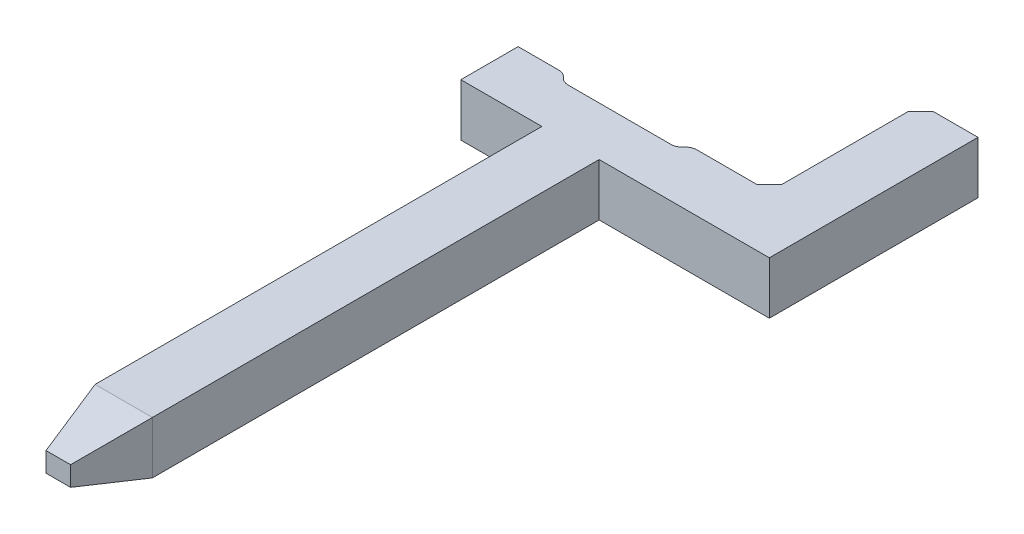
ISO-10303-21;
HEADER;
FILE_DESCRIPTION(('STEP AP214'),'2;1');
FILE_NAME('part.step','',(''),(''),'','','');
FILE_SCHEMA(('AUTOMOTIVE_DESIGN { 1 0 10303 214 1 1 1 1 }'));
ENDSEC;
DATA;
#1=APPLICATION_CONTEXT('core data for automotive mechanical design processes');
#2=APPLICATION_PROTOCOL_DEFINITION('international standard','automotive_design',2000,#1);
#3=PRODUCT_CONTEXT('',#1,'mechanical');
#4=PRODUCT('Part','Part','',(#3));
#5=PRODUCT_RELATED_PRODUCT_CATEGORY('part','',(#4));
#6=PRODUCT_DEFINITION_FORMATION('','',#4);
#7=PRODUCT_DEFINITION_CONTEXT('part definition',#1,'design');
#8=PRODUCT_DEFINITION('design','',#6,#7);
#9=PRODUCT_DEFINITION_SHAPE('','',#8);
#10=(LENGTH_UNIT() NAMED_UNIT(*) SI_UNIT(.MILLI.,.METRE.));
#11=(NAMED_UNIT(*) PLANE_ANGLE_UNIT() SI_UNIT($,.RADIAN.));
#12=(NAMED_UNIT(*) SI_UNIT($,.STERADIAN.) SOLID_ANGLE_UNIT());
#13=UNCERTAINTY_MEASURE_WITH_UNIT(LENGTH_MEASURE(1.E-05),#10,'distance_accuracy_value','');
#14=(GEOMETRIC_REPRESENTATION_CONTEXT(3) GLOBAL_UNCERTAINTY_ASSIGNED_CONTEXT((#13)) GLOBAL_UNIT_ASSIGNED_CONTEXT((#10,
#11,#12)) REPRESENTATION_CONTEXT('',''));
#15=CARTESIAN_POINT('',(0.,0.,0.));
#16=DIRECTION('',(0.,0.,1.));
#17=DIRECTION('',(1.,0.,0.));
#18=AXIS2_PLACEMENT_3D('',#15,#16,#17);
#19=CARTESIAN_POINT('',(3.23,-13.82,-4.6));
#20=DIRECTION('',(-0.707106781186548,0.,-0.707106781186548));
#21=DIRECTION('',(-0.707106781186548,0.,0.707106781186548));
#22=AXIS2_PLACEMENT_3D('',#19,#20,#21);
#23=PLANE('',#22);
#24=DIRECTION('',(0.707106781186548,0.,-0.707106781186548));
#25=VECTOR('',#24,1.);
#26=CARTESIAN_POINT('',(2.64065044188854,-13.82,-4.01065044188854));
#27=LINE('',#26,#25);
#28=CARTESIAN_POINT('',(3.08,-13.82,-4.45));
#29=VERTEX_POINT('',#28);
#30=CARTESIAN_POINT('',(3.23,-13.82,-4.6));
#31=VERTEX_POINT('',#30);
#32=EDGE_CURVE('E307',#29,#31,#27,.T.);
#33=ORIENTED_EDGE('',*,*,#32,.F.);
#34=DIRECTION('',(0.,-1.,0.));
#35=VECTOR('',#34,1.);
#36=CARTESIAN_POINT('',(3.08,-13.82,-4.45));
#37=LINE('',#36,#35);
#38=CARTESIAN_POINT('',(3.08,-13.18,-4.45));
#39=VERTEX_POINT('',#38);
#40=EDGE_CURVE('E234',#39,#29,#37,.T.);
#41=ORIENTED_EDGE('',*,*,#40,.F.);
#42=DIRECTION('',(-0.707106781186548,0.,0.707106781186548));
#43=VECTOR('',#42,1.);
#44=CARTESIAN_POINT('',(3.23,-13.18,-4.6));
#45=LINE('',#44,#43);
#46=CARTESIAN_POINT('',(3.23,-13.18,-4.6));
#47=VERTEX_POINT('',#46);
#48=EDGE_CURVE('E231',#47,#39,#45,.T.);
#49=ORIENTED_EDGE('',*,*,#48,.F.);
#50=DIRECTION('',(0.,1.,0.));
#51=VECTOR('',#50,1.);
#52=CARTESIAN_POINT('',(3.23,-13.18,-4.6));
#53=LINE('',#52,#51);
#54=EDGE_CURVE('E235',#31,#47,#53,.T.);
#55=ORIENTED_EDGE('',*,*,#54,.F.);
#56=EDGE_LOOP('',(#33,#41,#49,#55));
#57=FACE_BOUND('',#56,.T.);
#58=ADVANCED_FACE('F16',(#57),#23,.T.);
#59=CARTESIAN_POINT('',(3.38,-13.82,-6.3));
#60=DIRECTION('',(0.707106781186548,0.,0.707106781186548));
#61=DIRECTION('',(0.,-1.,0.));
#62=AXIS2_PLACEMENT_3D('',#59,#60,#61);
#63=PLANE('',#62);
#64=DIRECTION('',(0.707106781186548,0.,-0.707106781186548));
#65=VECTOR('',#64,1.);
#66=CARTESIAN_POINT('',(3.38,-13.82,-6.3));
#67=LINE('',#66,#65);
#68=CARTESIAN_POINT('',(3.23,-13.82,-6.15));
#69=VERTEX_POINT('',#68);
#70=CARTESIAN_POINT('',(3.38,-13.82,-6.3));
#71=VERTEX_POINT('',#70);
#72=EDGE_CURVE('E355',#69,#71,#67,.T.);
#73=ORIENTED_EDGE('',*,*,#72,.F.);
#74=DIRECTION('',(0.,-1.,0.));
#75=VECTOR('',#74,1.);
#76=CARTESIAN_POINT('',(3.23,-13.82,-6.15));
#77=LINE('',#76,#75);
#78=CARTESIAN_POINT('',(3.23,-13.18,-6.15));
#79=VERTEX_POINT('',#78);
#80=EDGE_CURVE('E296',#79,#69,#77,.T.);
#81=ORIENTED_EDGE('',*,*,#80,.F.);
#82=DIRECTION('',(-0.707106781186548,0.,0.707106781186548));
#83=VECTOR('',#82,1.);
#84=CARTESIAN_POINT('',(1.86565044188855,-13.18,-4.78565044188854));
#85=LINE('',#84,#83);
#86=CARTESIAN_POINT('',(3.38,-13.18,-6.3));
#87=VERTEX_POINT('',#86);
#88=EDGE_CURVE('E311',#87,#79,#85,.T.);
#89=ORIENTED_EDGE('',*,*,#88,.F.);
#90=DIRECTION('',(0.,1.,0.));
#91=VECTOR('',#90,1.);
#92=CARTESIAN_POINT('',(3.38,-13.82,-6.3));
#93=LINE('',#92,#91);
#94=EDGE_CURVE('E365',#71,#87,#93,.T.);
#95=ORIENTED_EDGE('',*,*,#94,.F.);
#96=EDGE_LOOP('',(#73,#81,#89,#95));
#97=FACE_BOUND('',#96,.T.);
#98=ADVANCED_FACE('F472',(#97),#63,.F.);
#99=CARTESIAN_POINT('',(2.34617265627772,-13.18,1.71));
#100=DIRECTION('',(0.,-0.970142500145332,-0.242535625036333));
#101=DIRECTION('',(0.,0.242535625036333,-0.970142500145332));
#102=AXIS2_PLACEMENT_3D('',#99,#100,#101);
#103=PLANE('',#102);
#104=DIRECTION('',(0.235702260395516,-0.235702260395516,0.942809041582063));
#105=VECTOR('',#104,1.);
#106=CARTESIAN_POINT('',(1.18555555555556,-13.2155555555556,1.85222222222222));
#107=LINE('',#106,#105);
#108=CARTESIAN_POINT('',(1.15,-13.18,1.71));
#109=VERTEX_POINT('',#108);
#110=CARTESIAN_POINT('',(1.35,-13.38,2.51));
#111=VERTEX_POINT('',#110);
#112=EDGE_CURVE('E26',#109,#111,#107,.T.);
#113=ORIENTED_EDGE('',*,*,#112,.T.);
#114=DIRECTION('',(-1.,0.,0.));
#115=VECTOR('',#114,1.);
#116=CARTESIAN_POINT('',(1.85,-13.38,2.51));
#117=LINE('',#116,#115);
#118=CARTESIAN_POINT('',(1.65,-13.38,2.51));
#119=VERTEX_POINT('',#118);
#120=EDGE_CURVE('E343',#119,#111,#117,.T.);
#121=ORIENTED_EDGE('',*,*,#120,.F.);
#122=DIRECTION('',(0.235702260395516,0.235702260395516,-0.942809041582063));
#123=VECTOR('',#122,1.);
#124=CARTESIAN_POINT('',(1.62555555555556,-13.4044444444444,2.60777777777778));
#125=LINE('',#124,#123);
#126=CARTESIAN_POINT('',(1.85,-13.18,1.71));
#127=VERTEX_POINT('',#126);
#128=EDGE_CURVE('E11',#119,#127,#125,.T.);
#129=ORIENTED_EDGE('',*,*,#128,.T.);
#130=DIRECTION('',(1.,0.,0.));
#131=VECTOR('',#130,1.);
#132=CARTESIAN_POINT('',(2.34617265627772,-13.18,1.71));
#133=LINE('',#132,#131);
#134=EDGE_CURVE('E346',#109,#127,#133,.T.);
#135=ORIENTED_EDGE('',*,*,#134,.F.);
#136=EDGE_LOOP('',(#113,#121,#129,#135));
#137=FACE_BOUND('',#136,.T.);
#138=ADVANCED_FACE('F544',(#137),#103,.F.);
#139=CARTESIAN_POINT('',(1.65,-13.82,2.51));
#140=DIRECTION('',(-0.970142500145332,0.,-0.242535625036333));
#141=DIRECTION('',(-0.242535625036333,0.,0.970142500145332));
#142=AXIS2_PLACEMENT_3D('',#139,#140,#141);
#143=PLANE('',#142);
#144=DIRECTION('',(0.235702260395516,-0.235702260395516,-0.942809041582063));
#145=VECTOR('',#144,1.);
#146=CARTESIAN_POINT('',(1.66111111111111,-13.6311111111111,2.46555555555556));
#147=LINE('',#146,#145);
#148=CARTESIAN_POINT('',(1.65,-13.62,2.51));
#149=VERTEX_POINT('',#148);
#150=CARTESIAN_POINT('',(1.85,-13.82,1.71));
#151=VERTEX_POINT('',#150);
#152=EDGE_CURVE('E386',#149,#151,#147,.T.);
#153=ORIENTED_EDGE('',*,*,#152,.T.);
#154=DIRECTION('',(0.,-1.,0.));
#155=VECTOR('',#154,1.);
#156=CARTESIAN_POINT('',(1.85,-13.82,1.71));
#157=LINE('',#156,#155);
#158=EDGE_CURVE('E262',#127,#151,#157,.T.);
#159=ORIENTED_EDGE('',*,*,#158,.F.);
#160=ORIENTED_EDGE('',*,*,#128,.F.);
#161=DIRECTION('',(0.,1.,0.));
#162=VECTOR('',#161,1.);
#163=CARTESIAN_POINT('',(1.65,-13.82,2.51));
#164=LINE('',#163,#162);
#165=EDGE_CURVE('E377',#149,#119,#164,.T.);
#166=ORIENTED_EDGE('',*,*,#165,.F.);
#167=EDGE_LOOP('',(#153,#159,#160,#166));
#168=FACE_BOUND('',#167,.T.);
#169=ADVANCED_FACE('F548',(#168),#143,.F.);
#170=CARTESIAN_POINT('',(1.15,-13.82,1.71));
#171=DIRECTION('',(0.970142500145332,0.,-0.242535625036333));
#172=DIRECTION('',(0.,-1.,0.));
#173=AXIS2_PLACEMENT_3D('',#170,#171,#172);
#174=PLANE('',#173);
#175=DIRECTION('',(0.235702260395516,0.235702260395516,0.942809041582063));
#176=VECTOR('',#175,1.);
#177=CARTESIAN_POINT('',(1.15,-13.82,1.71));
#178=LINE('',#177,#176);
#179=CARTESIAN_POINT('',(1.15,-13.82,1.71));
#180=VERTEX_POINT('',#179);
#181=CARTESIAN_POINT('',(1.35,-13.62,2.51));
#182=VERTEX_POINT('',#181);
#183=EDGE_CURVE('E40',#180,#182,#178,.T.);
#184=ORIENTED_EDGE('',*,*,#183,.T.);
#185=DIRECTION('',(0.,-1.,0.));
#186=VECTOR('',#185,1.);
#187=CARTESIAN_POINT('',(1.35,-13.82,2.51));
#188=LINE('',#187,#186);
#189=EDGE_CURVE('E339',#111,#182,#188,.T.);
#190=ORIENTED_EDGE('',*,*,#189,.F.);
#191=ORIENTED_EDGE('',*,*,#112,.F.);
#192=DIRECTION('',(0.,1.,0.));
#193=VECTOR('',#192,1.);
#194=CARTESIAN_POINT('',(1.15,-13.82,1.71));
#195=LINE('',#194,#193);
#196=EDGE_CURVE('E347',#180,#109,#195,.T.);
#197=ORIENTED_EDGE('',*,*,#196,.F.);
#198=EDGE_LOOP('',(#184,#190,#191,#197));
#199=FACE_BOUND('',#198,.T.);
#200=ADVANCED_FACE('F558',(#199),#174,.F.);
#201=CARTESIAN_POINT('',(1.85,-13.62,2.51));
#202=DIRECTION('',(0.,-0.970142500145332,0.242535625036333));
#203=DIRECTION('',(-1.,0.,0.));
#204=AXIS2_PLACEMENT_3D('',#201,#202,#203);
#205=PLANE('',#204);
#206=ORIENTED_EDGE('',*,*,#152,.F.);
#207=DIRECTION('',(1.,0.,0.));
#208=VECTOR('',#207,1.);
#209=CARTESIAN_POINT('',(1.85,-13.62,2.51));
#210=LINE('',#209,#208);
#211=EDGE_CURVE('E19',#182,#149,#210,.T.);
#212=ORIENTED_EDGE('',*,*,#211,.F.);
#213=ORIENTED_EDGE('',*,*,#183,.F.);
#214=DIRECTION('',(-1.,0.,0.));
#215=VECTOR('',#214,1.);
#216=CARTESIAN_POINT('',(1.15,-13.82,1.71));
#217=LINE('',#216,#215);
#218=EDGE_CURVE('E312',#151,#180,#217,.T.);
#219=ORIENTED_EDGE('',*,*,#218,.F.);
#220=EDGE_LOOP('',(#206,#212,#213,#219));
#221=FACE_BOUND('',#220,.T.);
#222=ADVANCED_FACE('F561',(#221),#205,.T.);
#223=CARTESIAN_POINT('',(2.34617265627772,-13.18,-4.30512822749936));
#224=DIRECTION('',(0.,1.,0.));
#225=DIRECTION('',(1.,0.,0.));
#226=AXIS2_PLACEMENT_3D('',#223,#224,#225);
#227=PLANE('',#226);
#228=DIRECTION('',(-1.,0.,0.));
#229=VECTOR('',#228,1.);
#230=CARTESIAN_POINT('',(3.93,-13.18,-6.3));
#231=LINE('',#230,#229);
#232=CARTESIAN_POINT('',(3.93,-13.18,-6.3));
#233=VERTEX_POINT('',#232);
#234=EDGE_CURVE('E362',#233,#87,#231,.T.);
#235=ORIENTED_EDGE('',*,*,#234,.T.);
#236=ORIENTED_EDGE('',*,*,#88,.T.);
#237=DIRECTION('',(0.,0.,1.));
#238=VECTOR('',#237,1.);
#239=CARTESIAN_POINT('',(3.23,-13.18,-6.3));
#240=LINE('',#239,#238);
#241=EDGE_CURVE('E300',#79,#47,#240,.T.);
#242=ORIENTED_EDGE('',*,*,#241,.T.);
#243=ORIENTED_EDGE('',*,*,#48,.T.);
#244=DIRECTION('',(-1.,0.,0.));
#245=VECTOR('',#244,1.);
#246=CARTESIAN_POINT('',(3.23,-13.18,-4.45));
#247=LINE('',#246,#245);
#248=CARTESIAN_POINT('',(2.34617265627772,-13.18,-4.45));
#249=VERTEX_POINT('',#248);
#250=EDGE_CURVE('E223',#39,#249,#247,.T.);
#251=ORIENTED_EDGE('',*,*,#250,.T.);
#252=CARTESIAN_POINT('',(2.34617265627772,-13.18,-4.30512822749936));
#253=DIRECTION('',(0.,1.,0.));
#254=DIRECTION('',(0.,0.,1.));
#255=AXIS2_PLACEMENT_3D('',#252,#253,#254);
#256=CIRCLE('',#255,0.144871772500637);
#257=CARTESIAN_POINT('',(2.23615942304884,-13.18,-4.39938807569574));
#258=VERTEX_POINT('',#257);
#259=EDGE_CURVE('E205',#249,#258,#256,.T.);
#260=ORIENTED_EDGE('',*,*,#259,.T.);
#261=CARTESIAN_POINT('',(2.12614618981995,-13.18,-4.49364792389211));
#262=DIRECTION('',(0.,-1.,0.));
#263=DIRECTION('',(0.,0.,-1.));
#264=AXIS2_PLACEMENT_3D('',#261,#262,#263);
#265=CIRCLE('',#264,0.144871772500637);
#266=CARTESIAN_POINT('',(2.12614618981995,-13.18,-4.34877615139147));
#267=VERTEX_POINT('',#266);
#268=EDGE_CURVE('E248',#258,#267,#265,.T.);
#269=ORIENTED_EDGE('',*,*,#268,.T.);
#270=DIRECTION('',(-1.,0.,0.));
#271=VECTOR('',#270,1.);
#272=CARTESIAN_POINT('',(0.873853810180058,-13.18,-4.34877615139147));
#273=LINE('',#272,#271);
#274=CARTESIAN_POINT('',(0.873853810180058,-13.18,-4.34877615139147));
#275=VERTEX_POINT('',#274);
#276=EDGE_CURVE('E283',#267,#275,#273,.T.);
#277=ORIENTED_EDGE('',*,*,#276,.T.);
#278=CARTESIAN_POINT('',(0.873853810180058,-13.18,-4.49364792389211));
#279=DIRECTION('',(0.,-1.,0.));
#280=DIRECTION('',(0.,0.,-1.));
#281=AXIS2_PLACEMENT_3D('',#278,#279,#280);
#282=CIRCLE('',#281,0.144871772500637);
#283=CARTESIAN_POINT('',(0.763840576951171,-13.18,-4.39938807569574));
#284=VERTEX_POINT('',#283);
#285=EDGE_CURVE('E281',#275,#284,#282,.T.);
#286=ORIENTED_EDGE('',*,*,#285,.T.);
#287=CARTESIAN_POINT('',(0.65382734372228,-13.18,-4.30512822749936));
#288=DIRECTION('',(0.,1.,0.));
#289=DIRECTION('',(0.,0.,1.));
#290=AXIS2_PLACEMENT_3D('',#287,#288,#289);
#291=CIRCLE('',#290,0.144871772500637);
#292=CARTESIAN_POINT('',(0.65382734372228,-13.18,-4.45));
#293=VERTEX_POINT('',#292);
#294=EDGE_CURVE('E249',#284,#293,#291,.T.);
#295=ORIENTED_EDGE('',*,*,#294,.T.);
#296=DIRECTION('',(-1.,0.,0.));
#297=VECTOR('',#296,1.);
#298=CARTESIAN_POINT('',(0.65382734372228,-13.18,-4.45));
#299=LINE('',#298,#297);
#300=CARTESIAN_POINT('',(0.16000000000001,-13.18,-4.45));
#301=VERTEX_POINT('',#300);
#302=EDGE_CURVE('E142',#293,#301,#299,.T.);
#303=ORIENTED_EDGE('',*,*,#302,.T.);
#304=DIRECTION('',(0.,0.,1.));
#305=VECTOR('',#304,1.);
#306=CARTESIAN_POINT('',(0.16000000000001,-13.18,-4.45));
#307=LINE('',#306,#305);
#308=CARTESIAN_POINT('',(0.16000000000001,-13.18,-3.75));
#309=VERTEX_POINT('',#308);
#310=EDGE_CURVE('E266',#301,#309,#307,.T.);
#311=ORIENTED_EDGE('',*,*,#310,.T.);
#312=DIRECTION('',(1.,0.,0.));
#313=VECTOR('',#312,1.);
#314=CARTESIAN_POINT('',(0.16000000000001,-13.18,-3.75));
#315=LINE('',#314,#313);
#316=CARTESIAN_POINT('',(1.15,-13.18,-3.75));
#317=VERTEX_POINT('',#316);
#318=EDGE_CURVE('E271',#309,#317,#315,.T.);
#319=ORIENTED_EDGE('',*,*,#318,.T.);
#320=DIRECTION('',(0.,0.,1.));
#321=VECTOR('',#320,1.);
#322=CARTESIAN_POINT('',(1.15,-13.18,2.51));
#323=LINE('',#322,#321);
#324=EDGE_CURVE('E351',#317,#109,#323,.T.);
#325=ORIENTED_EDGE('',*,*,#324,.T.);
#326=ORIENTED_EDGE('',*,*,#134,.T.);
#327=DIRECTION('',(0.,0.,-1.));
#328=VECTOR('',#327,1.);
#329=CARTESIAN_POINT('',(1.85,-13.18,-3.75));
#330=LINE('',#329,#328);
#331=CARTESIAN_POINT('',(1.85,-13.18,-3.75));
#332=VERTEX_POINT('',#331);
#333=EDGE_CURVE('E273',#127,#332,#330,.T.);
#334=ORIENTED_EDGE('',*,*,#333,.T.);
#335=DIRECTION('',(1.,0.,0.));
#336=VECTOR('',#335,1.);
#337=CARTESIAN_POINT('',(1.85,-13.18,-3.75));
#338=LINE('',#337,#336);
#339=CARTESIAN_POINT('',(3.93,-13.18,-3.75));
#340=VERTEX_POINT('',#339);
#341=EDGE_CURVE('E295',#332,#340,#338,.T.);
#342=ORIENTED_EDGE('',*,*,#341,.T.);
#343=DIRECTION('',(0.,0.,-1.));
#344=VECTOR('',#343,1.);
#345=CARTESIAN_POINT('',(3.93,-13.18,-3.75));
#346=LINE('',#345,#344);
#347=EDGE_CURVE('E315',#340,#233,#346,.T.);
#348=ORIENTED_EDGE('',*,*,#347,.T.);
#349=EDGE_LOOP('',(#235,#236,#242,#243,#251,#260,#269,#277,#286,#295,#303,#311,#319,#325,#326,
#334,#342,#348));
#350=FACE_BOUND('',#349,.T.);
#351=ADVANCED_FACE('F229',(#350),#227,.T.);
#352=CARTESIAN_POINT('',(2.34617265627772,-13.82,-4.30512822749936));
#353=DIRECTION('',(0.,1.,0.));
#354=DIRECTION('',(1.,0.,0.));
#355=AXIS2_PLACEMENT_3D('',#352,#353,#354);
#356=PLANE('',#355);
#357=DIRECTION('',(0.,0.,1.));
#358=VECTOR('',#357,1.);
#359=CARTESIAN_POINT('',(3.23,-13.82,-6.3));
#360=LINE('',#359,#358);
#361=EDGE_CURVE('E243',#69,#31,#360,.T.);
#362=ORIENTED_EDGE('',*,*,#361,.F.);
#363=ORIENTED_EDGE('',*,*,#72,.T.);
#364=DIRECTION('',(-1.,0.,0.));
#365=VECTOR('',#364,1.);
#366=CARTESIAN_POINT('',(3.93,-13.82,-6.3));
#367=LINE('',#366,#365);
#368=CARTESIAN_POINT('',(3.93,-13.82,-6.3));
#369=VERTEX_POINT('',#368);
#370=EDGE_CURVE('E387',#369,#71,#367,.T.);
#371=ORIENTED_EDGE('',*,*,#370,.F.);
#372=DIRECTION('',(0.,0.,-1.));
#373=VECTOR('',#372,1.);
#374=CARTESIAN_POINT('',(3.93,-13.82,-3.75));
#375=LINE('',#374,#373);
#376=CARTESIAN_POINT('',(3.93,-13.82,-3.75));
#377=VERTEX_POINT('',#376);
#378=EDGE_CURVE('E357',#377,#369,#375,.T.);
#379=ORIENTED_EDGE('',*,*,#378,.F.);
#380=DIRECTION('',(1.,0.,0.));
#381=VECTOR('',#380,1.);
#382=CARTESIAN_POINT('',(1.85,-13.82,-3.75));
#383=LINE('',#382,#381);
#384=CARTESIAN_POINT('',(1.85,-13.82,-3.75));
#385=VERTEX_POINT('',#384);
#386=EDGE_CURVE('E290',#385,#377,#383,.T.);
#387=ORIENTED_EDGE('',*,*,#386,.F.);
#388=DIRECTION('',(0.,0.,-1.));
#389=VECTOR('',#388,1.);
#390=CARTESIAN_POINT('',(1.85,-13.82,-3.75));
#391=LINE('',#390,#389);
#392=EDGE_CURVE('E257',#151,#385,#391,.T.);
#393=ORIENTED_EDGE('',*,*,#392,.F.);
#394=ORIENTED_EDGE('',*,*,#218,.T.);
#395=DIRECTION('',(0.,0.,1.));
#396=VECTOR('',#395,1.);
#397=CARTESIAN_POINT('',(1.15,-13.82,2.51));
#398=LINE('',#397,#396);
#399=CARTESIAN_POINT('',(1.15,-13.82,-3.75));
#400=VERTEX_POINT('',#399);
#401=EDGE_CURVE('E352',#400,#180,#398,.T.);
#402=ORIENTED_EDGE('',*,*,#401,.F.);
#403=DIRECTION('',(1.,0.,0.));
#404=VECTOR('',#403,1.);
#405=CARTESIAN_POINT('',(0.16000000000001,-13.82,-3.75));
#406=LINE('',#405,#404);
#407=CARTESIAN_POINT('',(0.16000000000001,-13.82,-3.75));
#408=VERTEX_POINT('',#407);
#409=EDGE_CURVE('E317',#408,#400,#406,.T.);
#410=ORIENTED_EDGE('',*,*,#409,.F.);
#411=DIRECTION('',(0.,0.,1.));
#412=VECTOR('',#411,1.);
#413=CARTESIAN_POINT('',(0.16000000000001,-13.82,-4.45));
#414=LINE('',#413,#412);
#415=CARTESIAN_POINT('',(0.16000000000001,-13.82,-4.45));
#416=VERTEX_POINT('',#415);
#417=EDGE_CURVE('E272',#416,#408,#414,.T.);
#418=ORIENTED_EDGE('',*,*,#417,.F.);
#419=DIRECTION('',(-1.,0.,0.));
#420=VECTOR('',#419,1.);
#421=CARTESIAN_POINT('',(0.65382734372228,-13.82,-4.45));
#422=LINE('',#421,#420);
#423=CARTESIAN_POINT('',(0.65382734372228,-13.82,-4.45));
#424=VERTEX_POINT('',#423);
#425=EDGE_CURVE('E128',#424,#416,#422,.T.);
#426=ORIENTED_EDGE('',*,*,#425,.F.);
#427=CARTESIAN_POINT('',(0.65382734372228,-13.82,-4.30512822749936));
#428=DIRECTION('',(0.,1.,0.));
#429=DIRECTION('',(0.,0.,1.));
#430=AXIS2_PLACEMENT_3D('',#427,#428,#429);
#431=CIRCLE('',#430,0.144871772500637);
#432=CARTESIAN_POINT('',(0.763840576951171,-13.82,-4.39938807569574));
#433=VERTEX_POINT('',#432);
#434=EDGE_CURVE('E253',#433,#424,#431,.T.);
#435=ORIENTED_EDGE('',*,*,#434,.F.);
#436=CARTESIAN_POINT('',(0.873853810180058,-13.82,-4.49364792389211));
#437=DIRECTION('',(0.,-1.,0.));
#438=DIRECTION('',(0.,0.,-1.));
#439=AXIS2_PLACEMENT_3D('',#436,#437,#438);
#440=CIRCLE('',#439,0.144871772500637);
#441=CARTESIAN_POINT('',(0.873853810180058,-13.82,-4.34877615139147));
#442=VERTEX_POINT('',#441);
#443=EDGE_CURVE('E325',#442,#433,#440,.T.);
#444=ORIENTED_EDGE('',*,*,#443,.F.);
#445=DIRECTION('',(-1.,0.,0.));
#446=VECTOR('',#445,1.);
#447=CARTESIAN_POINT('',(0.873853810180058,-13.82,-4.34877615139147));
#448=LINE('',#447,#446);
#449=CARTESIAN_POINT('',(2.12614618981995,-13.82,-4.34877615139147));
#450=VERTEX_POINT('',#449);
#451=EDGE_CURVE('E282',#450,#442,#448,.T.);
#452=ORIENTED_EDGE('',*,*,#451,.F.);
#453=CARTESIAN_POINT('',(2.12614618981995,-13.82,-4.49364792389211));
#454=DIRECTION('',(0.,-1.,0.));
#455=DIRECTION('',(0.,0.,-1.));
#456=AXIS2_PLACEMENT_3D('',#453,#454,#455);
#457=CIRCLE('',#456,0.144871772500637);
#458=CARTESIAN_POINT('',(2.23615942304884,-13.82,-4.39938807569574));
#459=VERTEX_POINT('',#458);
#460=EDGE_CURVE('E332',#459,#450,#457,.T.);
#461=ORIENTED_EDGE('',*,*,#460,.F.);
#462=CARTESIAN_POINT('',(2.34617265627772,-13.82,-4.30512822749936));
#463=DIRECTION('',(0.,1.,0.));
#464=DIRECTION('',(0.,0.,1.));
#465=AXIS2_PLACEMENT_3D('',#462,#463,#464);
#466=CIRCLE('',#465,0.144871772500637);
#467=CARTESIAN_POINT('',(2.34617265627772,-13.82,-4.45));
#468=VERTEX_POINT('',#467);
#469=EDGE_CURVE('E217',#468,#459,#466,.T.);
#470=ORIENTED_EDGE('',*,*,#469,.F.);
#471=DIRECTION('',(-1.,0.,0.));
#472=VECTOR('',#471,1.);
#473=CARTESIAN_POINT('',(3.23,-13.82,-4.45));
#474=LINE('',#473,#472);
#475=EDGE_CURVE('E225',#29,#468,#474,.T.);
#476=ORIENTED_EDGE('',*,*,#475,.F.);
#477=ORIENTED_EDGE('',*,*,#32,.T.);
#478=EDGE_LOOP('',(#362,#363,#371,#379,#387,#393,#394,#402,#410,#418,#426,#435,#444,#452,#461,
#470,#476,#477));
#479=FACE_BOUND('',#478,.T.);
#480=ADVANCED_FACE('F483',(#479),#356,.F.);
#481=CARTESIAN_POINT('',(1.85,-13.82,2.51));
#482=DIRECTION('',(0.,0.,1.));
#483=DIRECTION('',(1.,0.,0.));
#484=AXIS2_PLACEMENT_3D('',#481,#482,#483);
#485=PLANE('',#484);
#486=ORIENTED_EDGE('',*,*,#165,.T.);
#487=ORIENTED_EDGE('',*,*,#120,.T.);
#488=ORIENTED_EDGE('',*,*,#189,.T.);
#489=ORIENTED_EDGE('',*,*,#211,.T.);
#490=EDGE_LOOP('',(#486,#487,#488,#489));
#491=FACE_BOUND('',#490,.T.);
#492=ADVANCED_FACE('F564',(#491),#485,.T.);
#493=CARTESIAN_POINT('',(1.15,-13.82,2.51));
#494=DIRECTION('',(-1.,0.,0.));
#495=DIRECTION('',(0.,0.,1.));
#496=AXIS2_PLACEMENT_3D('',#493,#494,#495);
#497=PLANE('',#496);
#498=ORIENTED_EDGE('',*,*,#401,.T.);
#499=ORIENTED_EDGE('',*,*,#196,.T.);
#500=ORIENTED_EDGE('',*,*,#324,.F.);
#501=DIRECTION('',(0.,1.,0.));
#502=VECTOR('',#501,1.);
#503=CARTESIAN_POINT('',(1.15,-13.82,-3.75));
#504=LINE('',#503,#502);
#505=EDGE_CURVE('E321',#400,#317,#504,.T.);
#506=ORIENTED_EDGE('',*,*,#505,.F.);
#507=EDGE_LOOP('',(#498,#499,#500,#506));
#508=FACE_BOUND('',#507,.T.);
#509=ADVANCED_FACE('F567',(#508),#497,.T.);
#510=CARTESIAN_POINT('',(0.16000000000001,-13.82,-3.75));
#511=DIRECTION('',(0.,0.,1.));
#512=DIRECTION('',(1.,0.,0.));
#513=AXIS2_PLACEMENT_3D('',#510,#511,#512);
#514=PLANE('',#513);
#515=ORIENTED_EDGE('',*,*,#318,.F.);
#516=DIRECTION('',(0.,1.,0.));
#517=VECTOR('',#516,1.);
#518=CARTESIAN_POINT('',(0.16000000000001,-13.82,-3.75));
#519=LINE('',#518,#517);
#520=EDGE_CURVE('E267',#408,#309,#519,.T.);
#521=ORIENTED_EDGE('',*,*,#520,.F.);
#522=ORIENTED_EDGE('',*,*,#409,.T.);
#523=ORIENTED_EDGE('',*,*,#505,.T.);
#524=EDGE_LOOP('',(#515,#521,#522,#523));
#525=FACE_BOUND('',#524,.T.);
#526=ADVANCED_FACE('F404',(#525),#514,.T.);
#527=CARTESIAN_POINT('',(0.16000000000001,-13.82,-4.45));
#528=DIRECTION('',(-1.,0.,0.));
#529=DIRECTION('',(0.,0.,1.));
#530=AXIS2_PLACEMENT_3D('',#527,#528,#529);
#531=PLANE('',#530);
#532=ORIENTED_EDGE('',*,*,#310,.F.);
#533=DIRECTION('',(0.,1.,0.));
#534=VECTOR('',#533,1.);
#535=CARTESIAN_POINT('',(0.16000000000001,-13.82,-4.45));
#536=LINE('',#535,#534);
#537=EDGE_CURVE('E263',#416,#301,#536,.T.);
#538=ORIENTED_EDGE('',*,*,#537,.F.);
#539=ORIENTED_EDGE('',*,*,#417,.T.);
#540=ORIENTED_EDGE('',*,*,#520,.T.);
#541=EDGE_LOOP('',(#532,#538,#539,#540));
#542=FACE_BOUND('',#541,.T.);
#543=ADVANCED_FACE('F410',(#542),#531,.T.);
#544=CARTESIAN_POINT('',(0.65382734372228,-13.82,-4.45));
#545=DIRECTION('',(0.,0.,-1.));
#546=DIRECTION('',(0.,-1.,0.));
#547=AXIS2_PLACEMENT_3D('',#544,#545,#546);
#548=PLANE('',#547);
#549=ORIENTED_EDGE('',*,*,#302,.F.);
#550=DIRECTION('',(0.,1.,0.));
#551=VECTOR('',#550,1.);
#552=CARTESIAN_POINT('',(0.65382734372228,-13.82,-4.45));
#553=LINE('',#552,#551);
#554=EDGE_CURVE('E374',#424,#293,#553,.T.);
#555=ORIENTED_EDGE('',*,*,#554,.F.);
#556=ORIENTED_EDGE('',*,*,#425,.T.);
#557=ORIENTED_EDGE('',*,*,#537,.T.);
#558=EDGE_LOOP('',(#549,#555,#556,#557));
#559=FACE_BOUND('',#558,.T.);
#560=ADVANCED_FACE('F411',(#559),#548,.T.);
#561=CARTESIAN_POINT('',(0.65382734372228,-13.82,-4.30512822749936));
#562=DIRECTION('',(0.,1.,0.));
#563=DIRECTION('',(0.,0.,1.));
#564=AXIS2_PLACEMENT_3D('',#561,#562,#563);
#565=CYLINDRICAL_SURFACE('',#564,0.144871772500637);
#566=ORIENTED_EDGE('',*,*,#294,.F.);
#567=DIRECTION('',(0.,1.,0.));
#568=VECTOR('',#567,1.);
#569=CARTESIAN_POINT('',(0.763840576951171,-13.82,-4.39938807569574));
#570=LINE('',#569,#568);
#571=EDGE_CURVE('E254',#433,#284,#570,.T.);
#572=ORIENTED_EDGE('',*,*,#571,.F.);
#573=ORIENTED_EDGE('',*,*,#434,.T.);
#574=ORIENTED_EDGE('',*,*,#554,.T.);
#575=EDGE_LOOP('',(#566,#572,#573,#574));
#576=FACE_BOUND('',#575,.T.);
#577=ADVANCED_FACE('F415',(#576),#565,.T.);
#578=CARTESIAN_POINT('',(0.873853810180058,-13.82,-4.49364792389211));
#579=DIRECTION('',(0.,1.,0.));
#580=DIRECTION('',(0.,0.,1.));
#581=AXIS2_PLACEMENT_3D('',#578,#579,#580);
#582=CYLINDRICAL_SURFACE('',#581,0.144871772500637);
#583=ORIENTED_EDGE('',*,*,#285,.F.);
#584=DIRECTION('',(0.,1.,0.));
#585=VECTOR('',#584,1.);
#586=CARTESIAN_POINT('',(0.873853810180058,-13.82,-4.34877615139147));
#587=LINE('',#586,#585);
#588=EDGE_CURVE('E277',#442,#275,#587,.T.);
#589=ORIENTED_EDGE('',*,*,#588,.F.);
#590=ORIENTED_EDGE('',*,*,#443,.T.);
#591=ORIENTED_EDGE('',*,*,#571,.T.);
#592=EDGE_LOOP('',(#583,#589,#590,#591));
#593=FACE_BOUND('',#592,.T.);
#594=ADVANCED_FACE('F529',(#593),#582,.F.);
#595=CARTESIAN_POINT('',(0.873853810180058,-13.82,-4.34877615139147));
#596=DIRECTION('',(0.,0.,-1.));
#597=DIRECTION('',(0.,-1.,0.));
#598=AXIS2_PLACEMENT_3D('',#595,#596,#597);
#599=PLANE('',#598);
#600=ORIENTED_EDGE('',*,*,#276,.F.);
#601=DIRECTION('',(0.,1.,0.));
#602=VECTOR('',#601,1.);
#603=CARTESIAN_POINT('',(2.12614618981995,-13.82,-4.34877615139147));
#604=LINE('',#603,#602);
#605=EDGE_CURVE('E287',#450,#267,#604,.T.);
#606=ORIENTED_EDGE('',*,*,#605,.F.);
#607=ORIENTED_EDGE('',*,*,#451,.T.);
#608=ORIENTED_EDGE('',*,*,#588,.T.);
#609=EDGE_LOOP('',(#600,#606,#607,#608));
#610=FACE_BOUND('',#609,.T.);
#611=ADVANCED_FACE('F526',(#610),#599,.T.);
#612=CARTESIAN_POINT('',(2.12614618981995,-13.82,-4.49364792389211));
#613=DIRECTION('',(0.,1.,0.));
#614=DIRECTION('',(0.,0.,1.));
#615=AXIS2_PLACEMENT_3D('',#612,#613,#614);
#616=CYLINDRICAL_SURFACE('',#615,0.144871772500637);
#617=ORIENTED_EDGE('',*,*,#268,.F.);
#618=DIRECTION('',(0.,1.,0.));
#619=VECTOR('',#618,1.);
#620=CARTESIAN_POINT('',(2.23615942304884,-13.82,-4.39938807569574));
#621=LINE('',#620,#619);
#622=EDGE_CURVE('E212',#459,#258,#621,.T.);
#623=ORIENTED_EDGE('',*,*,#622,.F.);
#624=ORIENTED_EDGE('',*,*,#460,.T.);
#625=ORIENTED_EDGE('',*,*,#605,.T.);
#626=EDGE_LOOP('',(#617,#623,#624,#625));
#627=FACE_BOUND('',#626,.T.);
#628=ADVANCED_FACE('F524',(#627),#616,.F.);
#629=CARTESIAN_POINT('',(2.34617265627772,-13.82,-4.30512822749936));
#630=DIRECTION('',(0.,1.,0.));
#631=DIRECTION('',(0.,0.,1.));
#632=AXIS2_PLACEMENT_3D('',#629,#630,#631);
#633=CYLINDRICAL_SURFACE('',#632,0.144871772500637);
#634=ORIENTED_EDGE('',*,*,#259,.F.);
#635=DIRECTION('',(0.,1.,0.));
#636=VECTOR('',#635,1.);
#637=CARTESIAN_POINT('',(2.34617265627772,-13.82,-4.45));
#638=LINE('',#637,#636);
#639=EDGE_CURVE('E209',#468,#249,#638,.T.);
#640=ORIENTED_EDGE('',*,*,#639,.F.);
#641=ORIENTED_EDGE('',*,*,#469,.T.);
#642=ORIENTED_EDGE('',*,*,#622,.T.);
#643=EDGE_LOOP('',(#634,#640,#641,#642));
#644=FACE_BOUND('',#643,.T.);
#645=ADVANCED_FACE('F207',(#644),#633,.T.);
#646=CARTESIAN_POINT('',(3.23,-13.82,-4.45));
#647=DIRECTION('',(0.,0.,-1.));
#648=DIRECTION('',(0.,-1.,0.));
#649=AXIS2_PLACEMENT_3D('',#646,#647,#648);
#650=PLANE('',#649);
#651=ORIENTED_EDGE('',*,*,#250,.F.);
#652=ORIENTED_EDGE('',*,*,#40,.T.);
#653=ORIENTED_EDGE('',*,*,#475,.T.);
#654=ORIENTED_EDGE('',*,*,#639,.T.);
#655=EDGE_LOOP('',(#651,#652,#653,#654));
#656=FACE_BOUND('',#655,.T.);
#657=ADVANCED_FACE('F221',(#656),#650,.T.);
#658=CARTESIAN_POINT('',(3.23,-13.82,-6.3));
#659=DIRECTION('',(-1.,0.,0.));
#660=DIRECTION('',(0.,0.,1.));
#661=AXIS2_PLACEMENT_3D('',#658,#659,#660);
#662=PLANE('',#661);
#663=ORIENTED_EDGE('',*,*,#241,.F.);
#664=ORIENTED_EDGE('',*,*,#80,.T.);
#665=ORIENTED_EDGE('',*,*,#361,.T.);
#666=ORIENTED_EDGE('',*,*,#54,.T.);
#667=EDGE_LOOP('',(#663,#664,#665,#666));
#668=FACE_BOUND('',#667,.T.);
#669=ADVANCED_FACE('F486',(#668),#662,.T.);
#670=CARTESIAN_POINT('',(3.93,-13.82,-6.3));
#671=DIRECTION('',(0.,0.,-1.));
#672=DIRECTION('',(0.,-1.,0.));
#673=AXIS2_PLACEMENT_3D('',#670,#671,#672);
#674=PLANE('',#673);
#675=ORIENTED_EDGE('',*,*,#370,.T.);
#676=ORIENTED_EDGE('',*,*,#94,.T.);
#677=ORIENTED_EDGE('',*,*,#234,.F.);
#678=DIRECTION('',(0.,1.,0.));
#679=VECTOR('',#678,1.);
#680=CARTESIAN_POINT('',(3.93,-13.82,-6.3));
#681=LINE('',#680,#679);
#682=EDGE_CURVE('E361',#369,#233,#681,.T.);
#683=ORIENTED_EDGE('',*,*,#682,.F.);
#684=EDGE_LOOP('',(#675,#676,#677,#683));
#685=FACE_BOUND('',#684,.T.);
#686=ADVANCED_FACE('F469',(#685),#674,.T.);
#687=CARTESIAN_POINT('',(3.93,-13.82,-3.75));
#688=DIRECTION('',(1.,0.,0.));
#689=DIRECTION('',(0.,0.,1.));
#690=AXIS2_PLACEMENT_3D('',#687,#688,#689);
#691=PLANE('',#690);
#692=ORIENTED_EDGE('',*,*,#347,.F.);
#693=DIRECTION('',(0.,1.,0.));
#694=VECTOR('',#693,1.);
#695=CARTESIAN_POINT('',(3.93,-13.82,-3.75));
#696=LINE('',#695,#694);
#697=EDGE_CURVE('E294',#377,#340,#696,.T.);
#698=ORIENTED_EDGE('',*,*,#697,.F.);
#699=ORIENTED_EDGE('',*,*,#378,.T.);
#700=ORIENTED_EDGE('',*,*,#682,.T.);
#701=EDGE_LOOP('',(#692,#698,#699,#700));
#702=FACE_BOUND('',#701,.T.);
#703=ADVANCED_FACE('F478',(#702),#691,.T.);
#704=CARTESIAN_POINT('',(1.85,-13.82,-3.75));
#705=DIRECTION('',(0.,0.,1.));
#706=DIRECTION('',(1.,0.,0.));
#707=AXIS2_PLACEMENT_3D('',#704,#705,#706);
#708=PLANE('',#707);
#709=ORIENTED_EDGE('',*,*,#341,.F.);
#710=DIRECTION('',(0.,1.,0.));
#711=VECTOR('',#710,1.);
#712=CARTESIAN_POINT('',(1.85,-13.82,-3.75));
#713=LINE('',#712,#711);
#714=EDGE_CURVE('E261',#385,#332,#713,.T.);
#715=ORIENTED_EDGE('',*,*,#714,.F.);
#716=ORIENTED_EDGE('',*,*,#386,.T.);
#717=ORIENTED_EDGE('',*,*,#697,.T.);
#718=EDGE_LOOP('',(#709,#715,#716,#717));
#719=FACE_BOUND('',#718,.T.);
#720=ADVANCED_FACE('F480',(#719),#708,.T.);
#721=CARTESIAN_POINT('',(1.85,-13.82,-3.75));
#722=DIRECTION('',(1.,0.,0.));
#723=DIRECTION('',(0.,0.,-1.));
#724=AXIS2_PLACEMENT_3D('',#721,#722,#723);
#725=PLANE('',#724);
#726=ORIENTED_EDGE('',*,*,#333,.F.);
#727=ORIENTED_EDGE('',*,*,#158,.T.);
#728=ORIENTED_EDGE('',*,*,#392,.T.);
#729=ORIENTED_EDGE('',*,*,#714,.T.);
#730=EDGE_LOOP('',(#726,#727,#728,#729));
#731=FACE_BOUND('',#730,.T.);
#732=ADVANCED_FACE('F552',(#731),#725,.T.);
#733=CLOSED_SHELL('',(#58,#98,#138,#169,#200,#222,#351,#480,#492,#509,#526,#543,#560,#577,#594,
#611,#628,#645,#657,#669,#686,#703,#720,#732));
#734=MANIFOLD_SOLID_BREP('B1',#733);
#735=ADVANCED_BREP_SHAPE_REPRESENTATION('',(#18,#734),#14);
#736=SHAPE_DEFINITION_REPRESENTATION(#9,#735);
ENDSEC;
END-ISO-10303-21;
